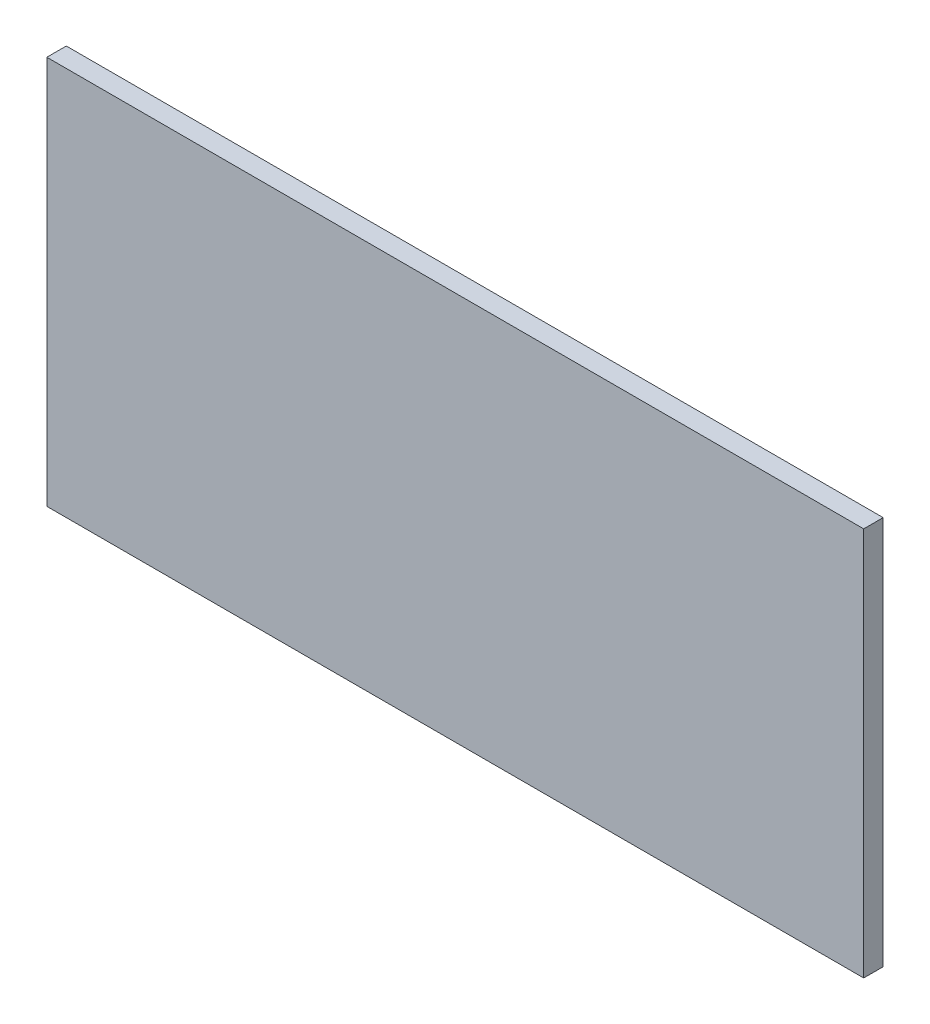
ISO-10303-21;
HEADER;
FILE_DESCRIPTION(('STEP AP214'),'2;1');
FILE_NAME('part.step','',(''),(''),'','','');
FILE_SCHEMA(('AUTOMOTIVE_DESIGN { 1 0 10303 214 1 1 1 1 }'));
ENDSEC;
DATA;
#1=APPLICATION_CONTEXT('core data for automotive mechanical design processes');
#2=APPLICATION_PROTOCOL_DEFINITION('international standard','automotive_design',2000,#1);
#3=PRODUCT_CONTEXT('',#1,'mechanical');
#4=PRODUCT('Part','Part','',(#3));
#5=PRODUCT_RELATED_PRODUCT_CATEGORY('part','',(#4));
#6=PRODUCT_DEFINITION_FORMATION('','',#4);
#7=PRODUCT_DEFINITION_CONTEXT('part definition',#1,'design');
#8=PRODUCT_DEFINITION('design','',#6,#7);
#9=PRODUCT_DEFINITION_SHAPE('','',#8);
#10=(LENGTH_UNIT() NAMED_UNIT(*) SI_UNIT(.MILLI.,.METRE.));
#11=(NAMED_UNIT(*) PLANE_ANGLE_UNIT() SI_UNIT($,.RADIAN.));
#12=(NAMED_UNIT(*) SI_UNIT($,.STERADIAN.) SOLID_ANGLE_UNIT());
#13=UNCERTAINTY_MEASURE_WITH_UNIT(LENGTH_MEASURE(1.E-05),#10,'distance_accuracy_value','');
#14=(GEOMETRIC_REPRESENTATION_CONTEXT(3) GLOBAL_UNCERTAINTY_ASSIGNED_CONTEXT((#13)) GLOBAL_UNIT_ASSIGNED_CONTEXT((#10,
#11,#12)) REPRESENTATION_CONTEXT('',''));
#15=CARTESIAN_POINT('',(0.,0.,0.));
#16=DIRECTION('',(0.,0.,1.));
#17=DIRECTION('',(1.,0.,0.));
#18=AXIS2_PLACEMENT_3D('',#15,#16,#17);
#19=CARTESIAN_POINT('',(-63.,30.,3.));
#20=DIRECTION('',(1.,0.,0.));
#21=DIRECTION('',(0.,0.,-1.));
#22=AXIS2_PLACEMENT_3D('',#19,#20,#21);
#23=PLANE('',#22);
#24=DIRECTION('',(0.,-1.,0.));
#25=VECTOR('',#24,1.);
#26=CARTESIAN_POINT('',(-63.,30.,0.));
#27=LINE('',#26,#25);
#28=CARTESIAN_POINT('',(-63.,30.,0.));
#29=VERTEX_POINT('',#28);
#30=CARTESIAN_POINT('',(-63.,-30.,0.));
#31=VERTEX_POINT('',#30);
#32=EDGE_CURVE('E98',#29,#31,#27,.T.);
#33=ORIENTED_EDGE('',*,*,#32,.T.);
#34=DIRECTION('',(0.,0.,-1.));
#35=VECTOR('',#34,1.);
#36=CARTESIAN_POINT('',(-63.,-30.,3.));
#37=LINE('',#36,#35);
#38=CARTESIAN_POINT('',(-63.,-30.,3.));
#39=VERTEX_POINT('',#38);
#40=EDGE_CURVE('E11',#39,#31,#37,.T.);
#41=ORIENTED_EDGE('',*,*,#40,.F.);
#42=DIRECTION('',(0.,-1.,0.));
#43=VECTOR('',#42,1.);
#44=CARTESIAN_POINT('',(-63.,30.,3.));
#45=LINE('',#44,#43);
#46=CARTESIAN_POINT('',(-63.,30.,3.));
#47=VERTEX_POINT('',#46);
#48=EDGE_CURVE('E86',#47,#39,#45,.T.);
#49=ORIENTED_EDGE('',*,*,#48,.F.);
#50=DIRECTION('',(0.,0.,-1.));
#51=VECTOR('',#50,1.);
#52=CARTESIAN_POINT('',(-63.,30.,3.));
#53=LINE('',#52,#51);
#54=EDGE_CURVE('E94',#47,#29,#53,.T.);
#55=ORIENTED_EDGE('',*,*,#54,.T.);
#56=EDGE_LOOP('',(#33,#41,#49,#55));
#57=FACE_BOUND('',#56,.T.);
#58=ADVANCED_FACE('F35',(#57),#23,.F.);
#59=CARTESIAN_POINT('',(-63.,-30.,3.));
#60=DIRECTION('',(0.,1.,0.));
#61=DIRECTION('',(-1.,0.,0.));
#62=AXIS2_PLACEMENT_3D('',#59,#60,#61);
#63=PLANE('',#62);
#64=DIRECTION('',(1.,0.,0.));
#65=VECTOR('',#64,1.);
#66=CARTESIAN_POINT('',(-63.,-30.,0.));
#67=LINE('',#66,#65);
#68=CARTESIAN_POINT('',(63.,-30.,0.));
#69=VERTEX_POINT('',#68);
#70=EDGE_CURVE('E90',#31,#69,#67,.T.);
#71=ORIENTED_EDGE('',*,*,#70,.T.);
#72=DIRECTION('',(0.,0.,-1.));
#73=VECTOR('',#72,1.);
#74=CARTESIAN_POINT('',(63.,-30.,3.));
#75=LINE('',#74,#73);
#76=CARTESIAN_POINT('',(63.,-30.,3.));
#77=VERTEX_POINT('',#76);
#78=EDGE_CURVE('E43',#77,#69,#75,.T.);
#79=ORIENTED_EDGE('',*,*,#78,.F.);
#80=DIRECTION('',(1.,0.,0.));
#81=VECTOR('',#80,1.);
#82=CARTESIAN_POINT('',(-63.,-30.,3.));
#83=LINE('',#82,#81);
#84=EDGE_CURVE('E81',#39,#77,#83,.T.);
#85=ORIENTED_EDGE('',*,*,#84,.F.);
#86=ORIENTED_EDGE('',*,*,#40,.T.);
#87=EDGE_LOOP('',(#71,#79,#85,#86));
#88=FACE_BOUND('',#87,.T.);
#89=ADVANCED_FACE('F89',(#88),#63,.F.);
#90=CARTESIAN_POINT('',(63.,30.,3.));
#91=DIRECTION('',(-1.,0.,0.));
#92=DIRECTION('',(0.,-1.,0.));
#93=AXIS2_PLACEMENT_3D('',#90,#91,#92);
#94=PLANE('',#93);
#95=DIRECTION('',(0.,1.,0.));
#96=VECTOR('',#95,1.);
#97=CARTESIAN_POINT('',(63.,30.,0.));
#98=LINE('',#97,#96);
#99=CARTESIAN_POINT('',(63.,30.,0.));
#100=VERTEX_POINT('',#99);
#101=EDGE_CURVE('E68',#69,#100,#98,.T.);
#102=ORIENTED_EDGE('',*,*,#101,.T.);
#103=DIRECTION('',(0.,0.,-1.));
#104=VECTOR('',#103,1.);
#105=CARTESIAN_POINT('',(63.,30.,3.));
#106=LINE('',#105,#104);
#107=CARTESIAN_POINT('',(63.,30.,3.));
#108=VERTEX_POINT('',#107);
#109=EDGE_CURVE('E91',#108,#100,#106,.T.);
#110=ORIENTED_EDGE('',*,*,#109,.F.);
#111=DIRECTION('',(0.,1.,0.));
#112=VECTOR('',#111,1.);
#113=CARTESIAN_POINT('',(63.,30.,3.));
#114=LINE('',#113,#112);
#115=EDGE_CURVE('E84',#77,#108,#114,.T.);
#116=ORIENTED_EDGE('',*,*,#115,.F.);
#117=ORIENTED_EDGE('',*,*,#78,.T.);
#118=EDGE_LOOP('',(#102,#110,#116,#117));
#119=FACE_BOUND('',#118,.T.);
#120=ADVANCED_FACE('F92',(#119),#94,.F.);
#121=CARTESIAN_POINT('',(-63.,30.,3.));
#122=DIRECTION('',(0.,-1.,0.));
#123=DIRECTION('',(1.,0.,0.));
#124=AXIS2_PLACEMENT_3D('',#121,#122,#123);
#125=PLANE('',#124);
#126=DIRECTION('',(-1.,0.,0.));
#127=VECTOR('',#126,1.);
#128=CARTESIAN_POINT('',(-63.,30.,0.));
#129=LINE('',#128,#127);
#130=EDGE_CURVE('E74',#100,#29,#129,.T.);
#131=ORIENTED_EDGE('',*,*,#130,.T.);
#132=ORIENTED_EDGE('',*,*,#54,.F.);
#133=DIRECTION('',(-1.,0.,0.));
#134=VECTOR('',#133,1.);
#135=CARTESIAN_POINT('',(-63.,30.,3.));
#136=LINE('',#135,#134);
#137=EDGE_CURVE('E51',#108,#47,#136,.T.);
#138=ORIENTED_EDGE('',*,*,#137,.F.);
#139=ORIENTED_EDGE('',*,*,#109,.T.);
#140=EDGE_LOOP('',(#131,#132,#138,#139));
#141=FACE_BOUND('',#140,.T.);
#142=ADVANCED_FACE('F105',(#141),#125,.F.);
#143=CARTESIAN_POINT('',(0.,0.,3.));
#144=DIRECTION('',(0.,0.,1.));
#145=DIRECTION('',(1.,0.,0.));
#146=AXIS2_PLACEMENT_3D('',#143,#144,#145);
#147=PLANE('',#146);
#148=ORIENTED_EDGE('',*,*,#48,.T.);
#149=ORIENTED_EDGE('',*,*,#84,.T.);
#150=ORIENTED_EDGE('',*,*,#115,.T.);
#151=ORIENTED_EDGE('',*,*,#137,.T.);
#152=EDGE_LOOP('',(#148,#149,#150,#151));
#153=FACE_BOUND('',#152,.T.);
#154=ADVANCED_FACE('F82',(#153),#147,.T.);
#155=CARTESIAN_POINT('',(0.,0.,0.));
#156=DIRECTION('',(0.,0.,1.));
#157=DIRECTION('',(1.,0.,0.));
#158=AXIS2_PLACEMENT_3D('',#155,#156,#157);
#159=PLANE('',#158);
#160=ORIENTED_EDGE('',*,*,#32,.F.);
#161=ORIENTED_EDGE('',*,*,#130,.F.);
#162=ORIENTED_EDGE('',*,*,#101,.F.);
#163=ORIENTED_EDGE('',*,*,#70,.F.);
#164=EDGE_LOOP('',(#160,#161,#162,#163));
#165=FACE_BOUND('',#164,.T.);
#166=ADVANCED_FACE('F108',(#165),#159,.F.);
#167=CLOSED_SHELL('',(#58,#89,#120,#142,#154,#166));
#168=MANIFOLD_SOLID_BREP('B2',#167);
#169=ADVANCED_BREP_SHAPE_REPRESENTATION('',(#18,#168),#14);
#170=SHAPE_DEFINITION_REPRESENTATION(#9,#169);
ENDSEC;
END-ISO-10303-21;
